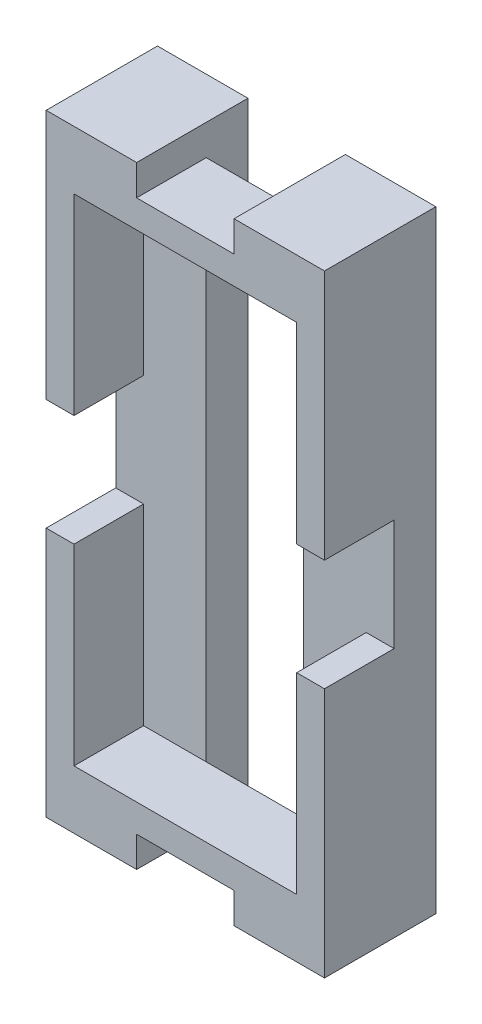
ISO-10303-21;
HEADER;
FILE_DESCRIPTION(('STEP AP214'),'2;1');
FILE_NAME('part.step','',(''),(''),'','','');
FILE_SCHEMA(('AUTOMOTIVE_DESIGN { 1 0 10303 214 1 1 1 1 }'));
ENDSEC;
DATA;
#1=APPLICATION_CONTEXT('core data for automotive mechanical design processes');
#2=APPLICATION_PROTOCOL_DEFINITION('international standard','automotive_design',2000,#1);
#3=PRODUCT_CONTEXT('',#1,'mechanical');
#4=PRODUCT('Part','Part','',(#3));
#5=PRODUCT_RELATED_PRODUCT_CATEGORY('part','',(#4));
#6=PRODUCT_DEFINITION_FORMATION('','',#4);
#7=PRODUCT_DEFINITION_CONTEXT('part definition',#1,'design');
#8=PRODUCT_DEFINITION('design','',#6,#7);
#9=PRODUCT_DEFINITION_SHAPE('','',#8);
#10=(LENGTH_UNIT() NAMED_UNIT(*) SI_UNIT(.MILLI.,.METRE.));
#11=(NAMED_UNIT(*) PLANE_ANGLE_UNIT() SI_UNIT($,.RADIAN.));
#12=(NAMED_UNIT(*) SI_UNIT($,.STERADIAN.) SOLID_ANGLE_UNIT());
#13=UNCERTAINTY_MEASURE_WITH_UNIT(LENGTH_MEASURE(1.E-05),#10,'distance_accuracy_value','');
#14=(GEOMETRIC_REPRESENTATION_CONTEXT(3) GLOBAL_UNCERTAINTY_ASSIGNED_CONTEXT((#13)) GLOBAL_UNIT_ASSIGNED_CONTEXT((#10,
#11,#12)) REPRESENTATION_CONTEXT('',''));
#15=CARTESIAN_POINT('',(0.,0.,0.));
#16=DIRECTION('',(0.,0.,1.));
#17=DIRECTION('',(1.,0.,0.));
#18=AXIS2_PLACEMENT_3D('',#15,#16,#17);
#19=CARTESIAN_POINT('',(0.,0.,4.));
#20=DIRECTION('',(0.,0.,-1.));
#21=DIRECTION('',(-1.,0.,0.));
#22=AXIS2_PLACEMENT_3D('',#19,#20,#21);
#23=PLANE('',#22);
#24=DIRECTION('',(0.,-1.,0.));
#25=VECTOR('',#24,1.);
#26=CARTESIAN_POINT('',(-5.,-11.,4.));
#27=LINE('',#26,#25);
#28=CARTESIAN_POINT('',(-5.,11.,4.));
#29=VERTEX_POINT('',#28);
#30=CARTESIAN_POINT('',(-5.,2.,4.));
#31=VERTEX_POINT('',#30);
#32=EDGE_CURVE('E350',#29,#31,#27,.T.);
#33=ORIENTED_EDGE('',*,*,#32,.T.);
#34=DIRECTION('',(-1.,0.,0.));
#35=VECTOR('',#34,1.);
#36=CARTESIAN_POINT('',(9.7169905660283,2.,4.));
#37=LINE('',#36,#35);
#38=CARTESIAN_POINT('',(-4.,2.,4.));
#39=VERTEX_POINT('',#38);
#40=EDGE_CURVE('E236',#39,#31,#37,.T.);
#41=ORIENTED_EDGE('',*,*,#40,.F.);
#42=DIRECTION('',(0.,-1.,0.));
#43=VECTOR('',#42,1.);
#44=CARTESIAN_POINT('',(-4.,-8.9,4.));
#45=LINE('',#44,#43);
#46=CARTESIAN_POINT('',(-4.,8.9,4.));
#47=VERTEX_POINT('',#46);
#48=EDGE_CURVE('E268',#47,#39,#45,.T.);
#49=ORIENTED_EDGE('',*,*,#48,.F.);
#50=DIRECTION('',(-1.,0.,0.));
#51=VECTOR('',#50,1.);
#52=CARTESIAN_POINT('',(-4.,8.9,4.));
#53=LINE('',#52,#51);
#54=CARTESIAN_POINT('',(4.,8.9,4.));
#55=VERTEX_POINT('',#54);
#56=EDGE_CURVE('E264',#55,#47,#53,.T.);
#57=ORIENTED_EDGE('',*,*,#56,.F.);
#58=DIRECTION('',(0.,1.,0.));
#59=VECTOR('',#58,1.);
#60=CARTESIAN_POINT('',(4.,-8.9,4.));
#61=LINE('',#60,#59);
#62=CARTESIAN_POINT('',(4.,2.,4.));
#63=VERTEX_POINT('',#62);
#64=EDGE_CURVE('E248',#63,#55,#61,.T.);
#65=ORIENTED_EDGE('',*,*,#64,.F.);
#66=CARTESIAN_POINT('',(5.,2.,4.));
#67=VERTEX_POINT('',#66);
#68=EDGE_CURVE('E234',#67,#63,#37,.T.);
#69=ORIENTED_EDGE('',*,*,#68,.F.);
#70=DIRECTION('',(0.,1.,0.));
#71=VECTOR('',#70,1.);
#72=CARTESIAN_POINT('',(5.,-11.,4.));
#73=LINE('',#72,#71);
#74=CARTESIAN_POINT('',(5.,11.,4.));
#75=VERTEX_POINT('',#74);
#76=EDGE_CURVE('E346',#67,#75,#73,.T.);
#77=ORIENTED_EDGE('',*,*,#76,.T.);
#78=DIRECTION('',(-1.,0.,0.));
#79=VECTOR('',#78,1.);
#80=CARTESIAN_POINT('',(-5.,11.,4.));
#81=LINE('',#80,#79);
#82=CARTESIAN_POINT('',(1.75,11.,4.));
#83=VERTEX_POINT('',#82);
#84=EDGE_CURVE('E347',#75,#83,#81,.T.);
#85=ORIENTED_EDGE('',*,*,#84,.T.);
#86=DIRECTION('',(0.,1.,0.));
#87=VECTOR('',#86,1.);
#88=CARTESIAN_POINT('',(1.75,11.,4.));
#89=LINE('',#88,#87);
#90=CARTESIAN_POINT('',(1.75,9.9,4.));
#91=VERTEX_POINT('',#90);
#92=EDGE_CURVE('E305',#91,#83,#89,.T.);
#93=ORIENTED_EDGE('',*,*,#92,.F.);
#94=DIRECTION('',(1.,0.,0.));
#95=VECTOR('',#94,1.);
#96=CARTESIAN_POINT('',(1.75,9.9,4.));
#97=LINE('',#96,#95);
#98=CARTESIAN_POINT('',(-1.75,9.9,4.));
#99=VERTEX_POINT('',#98);
#100=EDGE_CURVE('E309',#99,#91,#97,.T.);
#101=ORIENTED_EDGE('',*,*,#100,.F.);
#102=DIRECTION('',(0.,-1.,0.));
#103=VECTOR('',#102,1.);
#104=CARTESIAN_POINT('',(-1.75,11.,4.));
#105=LINE('',#104,#103);
#106=CARTESIAN_POINT('',(-1.75,11.,4.));
#107=VERTEX_POINT('',#106);
#108=EDGE_CURVE('E303',#107,#99,#105,.T.);
#109=ORIENTED_EDGE('',*,*,#108,.F.);
#110=EDGE_CURVE('E345',#107,#29,#81,.T.);
#111=ORIENTED_EDGE('',*,*,#110,.T.);
#112=EDGE_LOOP('',(#33,#41,#49,#57,#65,#69,#77,#85,#93,#101,#109,#111));
#113=FACE_BOUND('',#112,.T.);
#114=ADVANCED_FACE('F32',(#113),#23,.F.);
#115=CARTESIAN_POINT('',(4.,-8.9,-18.0151223414049));
#116=DIRECTION('',(1.,0.,0.));
#117=DIRECTION('',(0.,0.,-1.));
#118=AXIS2_PLACEMENT_3D('',#115,#116,#117);
#119=PLANE('',#118);
#120=DIRECTION('',(0.,-1.,0.));
#121=VECTOR('',#120,1.);
#122=CARTESIAN_POINT('',(4.,-8.9,1.5));
#123=LINE('',#122,#121);
#124=CARTESIAN_POINT('',(4.,8.9,1.5));
#125=VERTEX_POINT('',#124);
#126=CARTESIAN_POINT('',(4.,2.,1.5));
#127=VERTEX_POINT('',#126);
#128=EDGE_CURVE('E257',#125,#127,#123,.T.);
#129=ORIENTED_EDGE('',*,*,#128,.T.);
#130=DIRECTION('',(0.,0.,1.));
#131=VECTOR('',#130,1.);
#132=CARTESIAN_POINT('',(4.,2.,-18.0151223414049));
#133=LINE('',#132,#131);
#134=EDGE_CURVE('E245',#127,#63,#133,.T.);
#135=ORIENTED_EDGE('',*,*,#134,.T.);
#136=ORIENTED_EDGE('',*,*,#64,.T.);
#137=DIRECTION('',(0.,0.,1.));
#138=VECTOR('',#137,1.);
#139=CARTESIAN_POINT('',(4.,8.9,-18.0151223414049));
#140=LINE('',#139,#138);
#141=EDGE_CURVE('E274',#125,#55,#140,.T.);
#142=ORIENTED_EDGE('',*,*,#141,.F.);
#143=EDGE_LOOP('',(#129,#135,#136,#142));
#144=FACE_BOUND('',#143,.T.);
#145=ADVANCED_FACE('F480',(#144),#119,.F.);
#146=CARTESIAN_POINT('',(-4.,-8.9,-18.0151223414049));
#147=DIRECTION('',(-1.,0.,0.));
#148=DIRECTION('',(0.,0.,1.));
#149=AXIS2_PLACEMENT_3D('',#146,#147,#148);
#150=PLANE('',#149);
#151=ORIENTED_EDGE('',*,*,#48,.T.);
#152=DIRECTION('',(0.,0.,-1.));
#153=VECTOR('',#152,1.);
#154=CARTESIAN_POINT('',(-4.,2.,-18.0151223414049));
#155=LINE('',#154,#153);
#156=CARTESIAN_POINT('',(-4.,2.,1.5));
#157=VERTEX_POINT('',#156);
#158=EDGE_CURVE('E11',#39,#157,#155,.T.);
#159=ORIENTED_EDGE('',*,*,#158,.T.);
#160=DIRECTION('',(0.,1.,0.));
#161=VECTOR('',#160,1.);
#162=CARTESIAN_POINT('',(-4.,-8.9,1.5));
#163=LINE('',#162,#161);
#164=CARTESIAN_POINT('',(-4.,8.9,1.5));
#165=VERTEX_POINT('',#164);
#166=EDGE_CURVE('E252',#157,#165,#163,.T.);
#167=ORIENTED_EDGE('',*,*,#166,.T.);
#168=DIRECTION('',(0.,0.,1.));
#169=VECTOR('',#168,1.);
#170=CARTESIAN_POINT('',(-4.,8.9,-18.0151223414049));
#171=LINE('',#170,#169);
#172=EDGE_CURVE('E280',#165,#47,#171,.T.);
#173=ORIENTED_EDGE('',*,*,#172,.T.);
#174=EDGE_LOOP('',(#151,#159,#167,#173));
#175=FACE_BOUND('',#174,.T.);
#176=ADVANCED_FACE('F488',(#175),#150,.F.);
#177=CARTESIAN_POINT('',(0.,0.,1.5));
#178=DIRECTION('',(0.,0.,1.));
#179=DIRECTION('',(1.,0.,0.));
#180=AXIS2_PLACEMENT_3D('',#177,#178,#179);
#181=PLANE('',#180);
#182=DIRECTION('',(0.,1.,0.));
#183=VECTOR('',#182,1.);
#184=CARTESIAN_POINT('',(-1.75,-11.,1.5));
#185=LINE('',#184,#183);
#186=CARTESIAN_POINT('',(-1.75,-9.9,1.5));
#187=VERTEX_POINT('',#186);
#188=CARTESIAN_POINT('',(-1.75,-8.9,1.5));
#189=VERTEX_POINT('',#188);
#190=EDGE_CURVE('E318',#187,#189,#185,.T.);
#191=ORIENTED_EDGE('',*,*,#190,.T.);
#192=DIRECTION('',(1.,0.,0.));
#193=VECTOR('',#192,1.);
#194=CARTESIAN_POINT('',(0.,-8.9,1.5));
#195=LINE('',#194,#193);
#196=CARTESIAN_POINT('',(1.75,-8.9,1.5));
#197=VERTEX_POINT('',#196);
#198=EDGE_CURVE('E384',#189,#197,#195,.T.);
#199=ORIENTED_EDGE('',*,*,#198,.T.);
#200=DIRECTION('',(0.,-1.,0.));
#201=VECTOR('',#200,1.);
#202=CARTESIAN_POINT('',(1.75,-11.,1.5));
#203=LINE('',#202,#201);
#204=CARTESIAN_POINT('',(1.75,-9.9,1.5));
#205=VERTEX_POINT('',#204);
#206=EDGE_CURVE('E321',#197,#205,#203,.T.);
#207=ORIENTED_EDGE('',*,*,#206,.T.);
#208=DIRECTION('',(1.,0.,0.));
#209=VECTOR('',#208,1.);
#210=CARTESIAN_POINT('',(1.75,-9.9,1.5));
#211=LINE('',#210,#209);
#212=EDGE_CURVE('E287',#187,#205,#211,.T.);
#213=ORIENTED_EDGE('',*,*,#212,.F.);
#214=EDGE_LOOP('',(#191,#199,#207,#213));
#215=FACE_BOUND('',#214,.T.);
#216=ADVANCED_FACE('F427',(#215),#181,.F.);
#217=CARTESIAN_POINT('',(-5.,-11.,4.));
#218=DIRECTION('',(0.,1.,0.));
#219=DIRECTION('',(0.,0.,1.));
#220=AXIS2_PLACEMENT_3D('',#217,#218,#219);
#221=PLANE('',#220);
#222=DIRECTION('',(1.,0.,0.));
#223=VECTOR('',#222,1.);
#224=CARTESIAN_POINT('',(-5.,-11.,4.));
#225=LINE('',#224,#223);
#226=CARTESIAN_POINT('',(1.75,-11.,4.));
#227=VERTEX_POINT('',#226);
#228=CARTESIAN_POINT('',(5.,-11.,4.));
#229=VERTEX_POINT('',#228);
#230=EDGE_CURVE('E353',#227,#229,#225,.T.);
#231=ORIENTED_EDGE('',*,*,#230,.F.);
#232=DIRECTION('',(0.,0.,-1.));
#233=VECTOR('',#232,1.);
#234=CARTESIAN_POINT('',(1.75,-11.,1.5));
#235=LINE('',#234,#233);
#236=CARTESIAN_POINT('',(1.75,-11.,0.));
#237=VERTEX_POINT('',#236);
#238=EDGE_CURVE('E335',#227,#237,#235,.T.);
#239=ORIENTED_EDGE('',*,*,#238,.T.);
#240=DIRECTION('',(1.,0.,0.));
#241=VECTOR('',#240,1.);
#242=CARTESIAN_POINT('',(-5.,-11.,0.));
#243=LINE('',#242,#241);
#244=CARTESIAN_POINT('',(5.,-11.,0.));
#245=VERTEX_POINT('',#244);
#246=EDGE_CURVE('E366',#237,#245,#243,.T.);
#247=ORIENTED_EDGE('',*,*,#246,.T.);
#248=DIRECTION('',(0.,0.,-1.));
#249=VECTOR('',#248,1.);
#250=CARTESIAN_POINT('',(5.,-11.,4.));
#251=LINE('',#250,#249);
#252=EDGE_CURVE('E357',#229,#245,#251,.T.);
#253=ORIENTED_EDGE('',*,*,#252,.F.);
#254=EDGE_LOOP('',(#231,#239,#247,#253));
#255=FACE_BOUND('',#254,.T.);
#256=ADVANCED_FACE('F468',(#255),#221,.F.);
#257=CARTESIAN_POINT('',(-5.,11.,4.));
#258=DIRECTION('',(0.,-1.,0.));
#259=DIRECTION('',(0.,0.,-1.));
#260=AXIS2_PLACEMENT_3D('',#257,#258,#259);
#261=PLANE('',#260);
#262=DIRECTION('',(0.,0.,-1.));
#263=VECTOR('',#262,1.);
#264=CARTESIAN_POINT('',(1.75,11.,1.5));
#265=LINE('',#264,#263);
#266=CARTESIAN_POINT('',(1.75,11.,0.));
#267=VERTEX_POINT('',#266);
#268=EDGE_CURVE('E338',#83,#267,#265,.T.);
#269=ORIENTED_EDGE('',*,*,#268,.F.);
#270=ORIENTED_EDGE('',*,*,#84,.F.);
#271=DIRECTION('',(0.,0.,-1.));
#272=VECTOR('',#271,1.);
#273=CARTESIAN_POINT('',(5.,11.,4.));
#274=LINE('',#273,#272);
#275=CARTESIAN_POINT('',(5.,11.,0.));
#276=VERTEX_POINT('',#275);
#277=EDGE_CURVE('E378',#75,#276,#274,.T.);
#278=ORIENTED_EDGE('',*,*,#277,.T.);
#279=DIRECTION('',(-1.,0.,0.));
#280=VECTOR('',#279,1.);
#281=CARTESIAN_POINT('',(-5.,11.,0.));
#282=LINE('',#281,#280);
#283=EDGE_CURVE('E361',#276,#267,#282,.T.);
#284=ORIENTED_EDGE('',*,*,#283,.T.);
#285=EDGE_LOOP('',(#269,#270,#278,#284));
#286=FACE_BOUND('',#285,.T.);
#287=ADVANCED_FACE('F459',(#286),#261,.F.);
#288=CARTESIAN_POINT('',(0.,0.,0.));
#289=DIRECTION('',(0.,0.,-1.));
#290=DIRECTION('',(-1.,0.,0.));
#291=AXIS2_PLACEMENT_3D('',#288,#289,#290);
#292=PLANE('',#291);
#293=DIRECTION('',(0.,1.,0.));
#294=VECTOR('',#293,1.);
#295=CARTESIAN_POINT('',(-1.75,-11.,0.));
#296=LINE('',#295,#294);
#297=CARTESIAN_POINT('',(-1.75,-11.,0.));
#298=VERTEX_POINT('',#297);
#299=CARTESIAN_POINT('',(-1.75,11.,0.));
#300=VERTEX_POINT('',#299);
#301=EDGE_CURVE('E317',#298,#300,#296,.T.);
#302=ORIENTED_EDGE('',*,*,#301,.F.);
#303=CARTESIAN_POINT('',(-5.,-11.,0.));
#304=VERTEX_POINT('',#303);
#305=EDGE_CURVE('E367',#304,#298,#243,.T.);
#306=ORIENTED_EDGE('',*,*,#305,.F.);
#307=DIRECTION('',(0.,-1.,0.));
#308=VECTOR('',#307,1.);
#309=CARTESIAN_POINT('',(-5.,-11.,0.));
#310=LINE('',#309,#308);
#311=CARTESIAN_POINT('',(-5.,11.,0.));
#312=VERTEX_POINT('',#311);
#313=EDGE_CURVE('E364',#312,#304,#310,.T.);
#314=ORIENTED_EDGE('',*,*,#313,.F.);
#315=EDGE_CURVE('E360',#300,#312,#282,.T.);
#316=ORIENTED_EDGE('',*,*,#315,.F.);
#317=EDGE_LOOP('',(#302,#306,#314,#316));
#318=FACE_BOUND('',#317,.T.);
#319=ADVANCED_FACE('F442',(#318),#292,.T.);
#320=CARTESIAN_POINT('',(5.,-11.,4.));
#321=DIRECTION('',(-1.,0.,0.));
#322=DIRECTION('',(0.,0.,1.));
#323=AXIS2_PLACEMENT_3D('',#320,#321,#322);
#324=PLANE('',#323);
#325=ORIENTED_EDGE('',*,*,#76,.F.);
#326=DIRECTION('',(0.,0.,1.));
#327=VECTOR('',#326,1.);
#328=CARTESIAN_POINT('',(5.,2.,1.5));
#329=LINE('',#328,#327);
#330=CARTESIAN_POINT('',(5.,2.,1.5));
#331=VERTEX_POINT('',#330);
#332=EDGE_CURVE('E233',#331,#67,#329,.T.);
#333=ORIENTED_EDGE('',*,*,#332,.F.);
#334=DIRECTION('',(0.,1.,0.));
#335=VECTOR('',#334,1.);
#336=CARTESIAN_POINT('',(5.,2.,1.5));
#337=LINE('',#336,#335);
#338=CARTESIAN_POINT('',(5.,-2.,1.5));
#339=VERTEX_POINT('',#338);
#340=EDGE_CURVE('E243',#339,#331,#337,.T.);
#341=ORIENTED_EDGE('',*,*,#340,.F.);
#342=DIRECTION('',(0.,0.,-1.));
#343=VECTOR('',#342,1.);
#344=CARTESIAN_POINT('',(5.,-2.,1.5));
#345=LINE('',#344,#343);
#346=CARTESIAN_POINT('',(5.,-2.,4.));
#347=VERTEX_POINT('',#346);
#348=EDGE_CURVE('E240',#347,#339,#345,.T.);
#349=ORIENTED_EDGE('',*,*,#348,.F.);
#350=EDGE_CURVE('E342',#229,#347,#73,.T.);
#351=ORIENTED_EDGE('',*,*,#350,.F.);
#352=ORIENTED_EDGE('',*,*,#252,.T.);
#353=DIRECTION('',(0.,1.,0.));
#354=VECTOR('',#353,1.);
#355=CARTESIAN_POINT('',(5.,-11.,0.));
#356=LINE('',#355,#354);
#357=EDGE_CURVE('E334',#245,#276,#356,.T.);
#358=ORIENTED_EDGE('',*,*,#357,.T.);
#359=ORIENTED_EDGE('',*,*,#277,.F.);
#360=EDGE_LOOP('',(#325,#333,#341,#349,#351,#352,#358,#359));
#361=FACE_BOUND('',#360,.T.);
#362=ADVANCED_FACE('F34',(#361),#324,.F.);
#363=ORIENTED_EDGE('',*,*,#110,.F.);
#364=DIRECTION('',(0.,0.,-1.));
#365=VECTOR('',#364,1.);
#366=CARTESIAN_POINT('',(-1.75,11.,1.5));
#367=LINE('',#366,#365);
#368=EDGE_CURVE('E327',#107,#300,#367,.T.);
#369=ORIENTED_EDGE('',*,*,#368,.T.);
#370=ORIENTED_EDGE('',*,*,#315,.T.);
#371=DIRECTION('',(0.,0.,-1.));
#372=VECTOR('',#371,1.);
#373=CARTESIAN_POINT('',(-5.,11.,4.));
#374=LINE('',#373,#372);
#375=EDGE_CURVE('E375',#29,#312,#374,.T.);
#376=ORIENTED_EDGE('',*,*,#375,.F.);
#377=EDGE_LOOP('',(#363,#369,#370,#376));
#378=FACE_BOUND('',#377,.T.);
#379=ADVANCED_FACE('F447',(#378),#261,.F.);
#380=CARTESIAN_POINT('',(-5.,-11.,4.));
#381=DIRECTION('',(1.,0.,0.));
#382=DIRECTION('',(0.,0.,-1.));
#383=AXIS2_PLACEMENT_3D('',#380,#381,#382);
#384=PLANE('',#383);
#385=DIRECTION('',(0.,-1.,0.));
#386=VECTOR('',#385,1.);
#387=CARTESIAN_POINT('',(-5.,2.,1.5));
#388=LINE('',#387,#386);
#389=CARTESIAN_POINT('',(-5.,2.,1.5));
#390=VERTEX_POINT('',#389);
#391=CARTESIAN_POINT('',(-5.,-2.,1.5));
#392=VERTEX_POINT('',#391);
#393=EDGE_CURVE('E214',#390,#392,#388,.T.);
#394=ORIENTED_EDGE('',*,*,#393,.F.);
#395=DIRECTION('',(0.,0.,-1.));
#396=VECTOR('',#395,1.);
#397=CARTESIAN_POINT('',(-5.,2.,1.5));
#398=LINE('',#397,#396);
#399=EDGE_CURVE('E211',#31,#390,#398,.T.);
#400=ORIENTED_EDGE('',*,*,#399,.F.);
#401=ORIENTED_EDGE('',*,*,#32,.F.);
#402=ORIENTED_EDGE('',*,*,#375,.T.);
#403=ORIENTED_EDGE('',*,*,#313,.T.);
#404=DIRECTION('',(0.,0.,-1.));
#405=VECTOR('',#404,1.);
#406=CARTESIAN_POINT('',(-5.,-11.,4.));
#407=LINE('',#406,#405);
#408=CARTESIAN_POINT('',(-5.,-11.,4.));
#409=VERTEX_POINT('',#408);
#410=EDGE_CURVE('E372',#409,#304,#407,.T.);
#411=ORIENTED_EDGE('',*,*,#410,.F.);
#412=CARTESIAN_POINT('',(-5.,-2.,4.));
#413=VERTEX_POINT('',#412);
#414=EDGE_CURVE('E225',#413,#409,#27,.T.);
#415=ORIENTED_EDGE('',*,*,#414,.F.);
#416=DIRECTION('',(0.,0.,1.));
#417=VECTOR('',#416,1.);
#418=CARTESIAN_POINT('',(-5.,-2.,1.5));
#419=LINE('',#418,#417);
#420=EDGE_CURVE('E207',#392,#413,#419,.T.);
#421=ORIENTED_EDGE('',*,*,#420,.F.);
#422=EDGE_LOOP('',(#394,#400,#401,#402,#403,#411,#415,#421));
#423=FACE_BOUND('',#422,.T.);
#424=ADVANCED_FACE('F223',(#423),#384,.F.);
#425=DIRECTION('',(0.,0.,-1.));
#426=VECTOR('',#425,1.);
#427=CARTESIAN_POINT('',(-1.75,-11.,1.5));
#428=LINE('',#427,#426);
#429=CARTESIAN_POINT('',(-1.75,-11.,4.));
#430=VERTEX_POINT('',#429);
#431=EDGE_CURVE('E332',#430,#298,#428,.T.);
#432=ORIENTED_EDGE('',*,*,#431,.F.);
#433=EDGE_CURVE('E354',#409,#430,#225,.T.);
#434=ORIENTED_EDGE('',*,*,#433,.F.);
#435=ORIENTED_EDGE('',*,*,#410,.T.);
#436=ORIENTED_EDGE('',*,*,#305,.T.);
#437=EDGE_LOOP('',(#432,#434,#435,#436));
#438=FACE_BOUND('',#437,.T.);
#439=ADVANCED_FACE('F437',(#438),#221,.F.);
#440=ORIENTED_EDGE('',*,*,#350,.T.);
#441=DIRECTION('',(-1.,0.,0.));
#442=VECTOR('',#441,1.);
#443=CARTESIAN_POINT('',(9.7169905660283,-2.,4.));
#444=LINE('',#443,#442);
#445=CARTESIAN_POINT('',(4.,-2.,4.));
#446=VERTEX_POINT('',#445);
#447=EDGE_CURVE('E237',#347,#446,#444,.T.);
#448=ORIENTED_EDGE('',*,*,#447,.T.);
#449=CARTESIAN_POINT('',(4.,-8.9,4.));
#450=VERTEX_POINT('',#449);
#451=EDGE_CURVE('E261',#450,#446,#61,.T.);
#452=ORIENTED_EDGE('',*,*,#451,.F.);
#453=DIRECTION('',(1.,0.,0.));
#454=VECTOR('',#453,1.);
#455=CARTESIAN_POINT('',(-4.,-8.9,4.));
#456=LINE('',#455,#454);
#457=CARTESIAN_POINT('',(-4.,-8.9,4.));
#458=VERTEX_POINT('',#457);
#459=EDGE_CURVE('E271',#458,#450,#456,.T.);
#460=ORIENTED_EDGE('',*,*,#459,.F.);
#461=CARTESIAN_POINT('',(-4.,-2.,4.));
#462=VERTEX_POINT('',#461);
#463=EDGE_CURVE('E267',#462,#458,#45,.T.);
#464=ORIENTED_EDGE('',*,*,#463,.F.);
#465=EDGE_CURVE('E55',#462,#413,#444,.T.);
#466=ORIENTED_EDGE('',*,*,#465,.T.);
#467=ORIENTED_EDGE('',*,*,#414,.T.);
#468=ORIENTED_EDGE('',*,*,#433,.T.);
#469=DIRECTION('',(0.,-1.,0.));
#470=VECTOR('',#469,1.);
#471=CARTESIAN_POINT('',(-1.75,-11.,4.));
#472=LINE('',#471,#470);
#473=CARTESIAN_POINT('',(-1.75,-9.9,4.));
#474=VERTEX_POINT('',#473);
#475=EDGE_CURVE('E288',#474,#430,#472,.T.);
#476=ORIENTED_EDGE('',*,*,#475,.F.);
#477=DIRECTION('',(-1.,0.,0.));
#478=VECTOR('',#477,1.);
#479=CARTESIAN_POINT('',(1.75,-9.9,4.));
#480=LINE('',#479,#478);
#481=CARTESIAN_POINT('',(1.75,-9.9,4.));
#482=VERTEX_POINT('',#481);
#483=EDGE_CURVE('E291',#482,#474,#480,.T.);
#484=ORIENTED_EDGE('',*,*,#483,.F.);
#485=DIRECTION('',(0.,1.,0.));
#486=VECTOR('',#485,1.);
#487=CARTESIAN_POINT('',(1.75,-11.,4.));
#488=LINE('',#487,#486);
#489=EDGE_CURVE('E294',#227,#482,#488,.T.);
#490=ORIENTED_EDGE('',*,*,#489,.F.);
#491=ORIENTED_EDGE('',*,*,#230,.T.);
#492=EDGE_LOOP('',(#440,#448,#452,#460,#464,#466,#467,#468,#476,#484,#490,#491));
#493=FACE_BOUND('',#492,.T.);
#494=ADVANCED_FACE('F392',(#493),#23,.F.);
#495=DIRECTION('',(0.,-1.,0.));
#496=VECTOR('',#495,1.);
#497=CARTESIAN_POINT('',(1.75,-11.,0.));
#498=LINE('',#497,#496);
#499=EDGE_CURVE('E330',#267,#237,#498,.T.);
#500=ORIENTED_EDGE('',*,*,#499,.F.);
#501=ORIENTED_EDGE('',*,*,#283,.F.);
#502=ORIENTED_EDGE('',*,*,#357,.F.);
#503=ORIENTED_EDGE('',*,*,#246,.F.);
#504=EDGE_LOOP('',(#500,#501,#502,#503));
#505=FACE_BOUND('',#504,.T.);
#506=ADVANCED_FACE('F457',(#505),#292,.T.);
#507=CARTESIAN_POINT('',(-1.75,-11.,1.5));
#508=DIRECTION('',(-1.,0.,0.));
#509=DIRECTION('',(0.,0.,1.));
#510=AXIS2_PLACEMENT_3D('',#507,#508,#509);
#511=PLANE('',#510);
#512=ORIENTED_EDGE('',*,*,#301,.T.);
#513=ORIENTED_EDGE('',*,*,#368,.F.);
#514=ORIENTED_EDGE('',*,*,#108,.T.);
#515=DIRECTION('',(0.,0.,-1.));
#516=VECTOR('',#515,1.);
#517=CARTESIAN_POINT('',(-1.75,9.9,7.66878726556883));
#518=LINE('',#517,#516);
#519=CARTESIAN_POINT('',(-1.75,9.9,1.5));
#520=VERTEX_POINT('',#519);
#521=EDGE_CURVE('E306',#99,#520,#518,.T.);
#522=ORIENTED_EDGE('',*,*,#521,.T.);
#523=CARTESIAN_POINT('',(-1.75,8.9,1.5));
#524=VERTEX_POINT('',#523);
#525=EDGE_CURVE('E323',#524,#520,#185,.T.);
#526=ORIENTED_EDGE('',*,*,#525,.F.);
#527=EDGE_CURVE('E322',#189,#524,#185,.T.);
#528=ORIENTED_EDGE('',*,*,#527,.F.);
#529=ORIENTED_EDGE('',*,*,#190,.F.);
#530=DIRECTION('',(0.,0.,-1.));
#531=VECTOR('',#530,1.);
#532=CARTESIAN_POINT('',(-1.75,-9.9,7.66878726556883));
#533=LINE('',#532,#531);
#534=EDGE_CURVE('E299',#474,#187,#533,.T.);
#535=ORIENTED_EDGE('',*,*,#534,.F.);
#536=ORIENTED_EDGE('',*,*,#475,.T.);
#537=ORIENTED_EDGE('',*,*,#431,.T.);
#538=EDGE_LOOP('',(#512,#513,#514,#522,#526,#528,#529,#535,#536,#537));
#539=FACE_BOUND('',#538,.T.);
#540=ADVANCED_FACE('F412',(#539),#511,.F.);
#541=CARTESIAN_POINT('',(1.75,-11.,1.5));
#542=DIRECTION('',(1.,0.,0.));
#543=DIRECTION('',(0.,0.,-1.));
#544=AXIS2_PLACEMENT_3D('',#541,#542,#543);
#545=PLANE('',#544);
#546=ORIENTED_EDGE('',*,*,#499,.T.);
#547=ORIENTED_EDGE('',*,*,#238,.F.);
#548=ORIENTED_EDGE('',*,*,#489,.T.);
#549=DIRECTION('',(0.,0.,-1.));
#550=VECTOR('',#549,1.);
#551=CARTESIAN_POINT('',(1.75,-9.9,7.66878726556883));
#552=LINE('',#551,#550);
#553=EDGE_CURVE('E292',#482,#205,#552,.T.);
#554=ORIENTED_EDGE('',*,*,#553,.T.);
#555=ORIENTED_EDGE('',*,*,#206,.F.);
#556=CARTESIAN_POINT('',(1.75,8.9,1.5));
#557=VERTEX_POINT('',#556);
#558=EDGE_CURVE('E328',#557,#197,#203,.T.);
#559=ORIENTED_EDGE('',*,*,#558,.F.);
#560=CARTESIAN_POINT('',(1.75,9.9,1.5));
#561=VERTEX_POINT('',#560);
#562=EDGE_CURVE('E324',#561,#557,#203,.T.);
#563=ORIENTED_EDGE('',*,*,#562,.F.);
#564=DIRECTION('',(0.,0.,-1.));
#565=VECTOR('',#564,1.);
#566=CARTESIAN_POINT('',(1.75,9.9,7.66878726556883));
#567=LINE('',#566,#565);
#568=EDGE_CURVE('E312',#91,#561,#567,.T.);
#569=ORIENTED_EDGE('',*,*,#568,.F.);
#570=ORIENTED_EDGE('',*,*,#92,.T.);
#571=ORIENTED_EDGE('',*,*,#268,.T.);
#572=EDGE_LOOP('',(#546,#547,#548,#554,#555,#559,#563,#569,#570,#571));
#573=FACE_BOUND('',#572,.T.);
#574=ADVANCED_FACE('F420',(#573),#545,.F.);
#575=ORIENTED_EDGE('',*,*,#562,.T.);
#576=DIRECTION('',(-1.,0.,0.));
#577=VECTOR('',#576,1.);
#578=CARTESIAN_POINT('',(0.,8.9,1.5));
#579=LINE('',#578,#577);
#580=EDGE_CURVE('E381',#557,#524,#579,.T.);
#581=ORIENTED_EDGE('',*,*,#580,.T.);
#582=ORIENTED_EDGE('',*,*,#525,.T.);
#583=DIRECTION('',(-1.,0.,0.));
#584=VECTOR('',#583,1.);
#585=CARTESIAN_POINT('',(1.75,9.9,1.5));
#586=LINE('',#585,#584);
#587=EDGE_CURVE('E296',#561,#520,#586,.T.);
#588=ORIENTED_EDGE('',*,*,#587,.F.);
#589=EDGE_LOOP('',(#575,#581,#582,#588));
#590=FACE_BOUND('',#589,.T.);
#591=ADVANCED_FACE('F409',(#590),#181,.F.);
#592=CARTESIAN_POINT('',(1.75,9.9,7.66878726556883));
#593=DIRECTION('',(0.,-1.,0.));
#594=DIRECTION('',(0.,0.,-1.));
#595=AXIS2_PLACEMENT_3D('',#592,#593,#594);
#596=PLANE('',#595);
#597=ORIENTED_EDGE('',*,*,#100,.T.);
#598=ORIENTED_EDGE('',*,*,#568,.T.);
#599=ORIENTED_EDGE('',*,*,#587,.T.);
#600=ORIENTED_EDGE('',*,*,#521,.F.);
#601=EDGE_LOOP('',(#597,#598,#599,#600));
#602=FACE_BOUND('',#601,.T.);
#603=ADVANCED_FACE('F417',(#602),#596,.F.);
#604=CARTESIAN_POINT('',(1.75,-9.9,7.66878726556883));
#605=DIRECTION('',(0.,1.,0.));
#606=DIRECTION('',(0.,0.,1.));
#607=AXIS2_PLACEMENT_3D('',#604,#605,#606);
#608=PLANE('',#607);
#609=ORIENTED_EDGE('',*,*,#483,.T.);
#610=ORIENTED_EDGE('',*,*,#534,.T.);
#611=ORIENTED_EDGE('',*,*,#212,.T.);
#612=ORIENTED_EDGE('',*,*,#553,.F.);
#613=EDGE_LOOP('',(#609,#610,#611,#612));
#614=FACE_BOUND('',#613,.T.);
#615=ADVANCED_FACE('F432',(#614),#608,.F.);
#616=CARTESIAN_POINT('',(0.,0.,1.5));
#617=DIRECTION('',(0.,0.,1.));
#618=DIRECTION('',(1.,0.,0.));
#619=AXIS2_PLACEMENT_3D('',#616,#617,#618);
#620=PLANE('',#619);
#621=ORIENTED_EDGE('',*,*,#527,.T.);
#622=DIRECTION('',(1.,0.,0.));
#623=VECTOR('',#622,1.);
#624=CARTESIAN_POINT('',(-4.,8.9,1.5));
#625=LINE('',#624,#623);
#626=EDGE_CURVE('E284',#165,#524,#625,.T.);
#627=ORIENTED_EDGE('',*,*,#626,.F.);
#628=ORIENTED_EDGE('',*,*,#166,.F.);
#629=DIRECTION('',(-1.,0.,0.));
#630=VECTOR('',#629,1.);
#631=CARTESIAN_POINT('',(9.7169905660283,2.,1.5));
#632=LINE('',#631,#630);
#633=EDGE_CURVE('E217',#157,#390,#632,.T.);
#634=ORIENTED_EDGE('',*,*,#633,.T.);
#635=ORIENTED_EDGE('',*,*,#393,.T.);
#636=DIRECTION('',(-1.,0.,0.));
#637=VECTOR('',#636,1.);
#638=CARTESIAN_POINT('',(9.7169905660283,-2.,1.5));
#639=LINE('',#638,#637);
#640=CARTESIAN_POINT('',(-4.,-2.,1.5));
#641=VERTEX_POINT('',#640);
#642=EDGE_CURVE('E203',#641,#392,#639,.T.);
#643=ORIENTED_EDGE('',*,*,#642,.F.);
#644=CARTESIAN_POINT('',(-4.,-8.9,1.5));
#645=VERTEX_POINT('',#644);
#646=EDGE_CURVE('E249',#645,#641,#163,.T.);
#647=ORIENTED_EDGE('',*,*,#646,.F.);
#648=DIRECTION('',(-1.,0.,0.));
#649=VECTOR('',#648,1.);
#650=CARTESIAN_POINT('',(-4.,-8.9,1.5));
#651=LINE('',#650,#649);
#652=EDGE_CURVE('E251',#189,#645,#651,.T.);
#653=ORIENTED_EDGE('',*,*,#652,.F.);
#654=EDGE_LOOP('',(#621,#627,#628,#634,#635,#643,#647,#653));
#655=FACE_BOUND('',#654,.T.);
#656=ADVANCED_FACE('F215',(#655),#620,.T.);
#657=CARTESIAN_POINT('',(4.,-2.,1.5));
#658=VERTEX_POINT('',#657);
#659=CARTESIAN_POINT('',(4.,-8.9,1.5));
#660=VERTEX_POINT('',#659);
#661=EDGE_CURVE('E256',#658,#660,#123,.T.);
#662=ORIENTED_EDGE('',*,*,#661,.F.);
#663=EDGE_CURVE('E47',#339,#658,#639,.T.);
#664=ORIENTED_EDGE('',*,*,#663,.F.);
#665=ORIENTED_EDGE('',*,*,#340,.T.);
#666=EDGE_CURVE('E230',#331,#127,#632,.T.);
#667=ORIENTED_EDGE('',*,*,#666,.T.);
#668=ORIENTED_EDGE('',*,*,#128,.F.);
#669=EDGE_CURVE('E260',#557,#125,#625,.T.);
#670=ORIENTED_EDGE('',*,*,#669,.F.);
#671=ORIENTED_EDGE('',*,*,#558,.T.);
#672=EDGE_CURVE('E253',#660,#197,#651,.T.);
#673=ORIENTED_EDGE('',*,*,#672,.F.);
#674=EDGE_LOOP('',(#662,#664,#665,#667,#668,#670,#671,#673));
#675=FACE_BOUND('',#674,.T.);
#676=ADVANCED_FACE('F472',(#675),#620,.T.);
#677=ORIENTED_EDGE('',*,*,#451,.T.);
#678=DIRECTION('',(0.,0.,-1.));
#679=VECTOR('',#678,1.);
#680=CARTESIAN_POINT('',(4.,-2.,-18.0151223414049));
#681=LINE('',#680,#679);
#682=EDGE_CURVE('E242',#446,#658,#681,.T.);
#683=ORIENTED_EDGE('',*,*,#682,.T.);
#684=ORIENTED_EDGE('',*,*,#661,.T.);
#685=DIRECTION('',(0.,0.,1.));
#686=VECTOR('',#685,1.);
#687=CARTESIAN_POINT('',(4.,-8.9,-18.0151223414049));
#688=LINE('',#687,#686);
#689=EDGE_CURVE('E275',#660,#450,#688,.T.);
#690=ORIENTED_EDGE('',*,*,#689,.T.);
#691=EDGE_LOOP('',(#677,#683,#684,#690));
#692=FACE_BOUND('',#691,.T.);
#693=ADVANCED_FACE('F470',(#692),#119,.F.);
#694=CARTESIAN_POINT('',(-4.,-8.9,-18.0151223414049));
#695=DIRECTION('',(0.,-1.,0.));
#696=DIRECTION('',(0.,0.,-1.));
#697=AXIS2_PLACEMENT_3D('',#694,#695,#696);
#698=PLANE('',#697);
#699=ORIENTED_EDGE('',*,*,#672,.T.);
#700=ORIENTED_EDGE('',*,*,#198,.F.);
#701=ORIENTED_EDGE('',*,*,#652,.T.);
#702=DIRECTION('',(0.,0.,1.));
#703=VECTOR('',#702,1.);
#704=CARTESIAN_POINT('',(-4.,-8.9,-18.0151223414049));
#705=LINE('',#704,#703);
#706=EDGE_CURVE('E277',#645,#458,#705,.T.);
#707=ORIENTED_EDGE('',*,*,#706,.T.);
#708=ORIENTED_EDGE('',*,*,#459,.T.);
#709=ORIENTED_EDGE('',*,*,#689,.F.);
#710=EDGE_LOOP('',(#699,#700,#701,#707,#708,#709));
#711=FACE_BOUND('',#710,.T.);
#712=ADVANCED_FACE('F396',(#711),#698,.F.);
#713=ORIENTED_EDGE('',*,*,#646,.T.);
#714=DIRECTION('',(0.,0.,1.));
#715=VECTOR('',#714,1.);
#716=CARTESIAN_POINT('',(-4.,-2.,-18.0151223414049));
#717=LINE('',#716,#715);
#718=EDGE_CURVE('E40',#641,#462,#717,.T.);
#719=ORIENTED_EDGE('',*,*,#718,.T.);
#720=ORIENTED_EDGE('',*,*,#463,.T.);
#721=ORIENTED_EDGE('',*,*,#706,.F.);
#722=EDGE_LOOP('',(#713,#719,#720,#721));
#723=FACE_BOUND('',#722,.T.);
#724=ADVANCED_FACE('F388',(#723),#150,.F.);
#725=CARTESIAN_POINT('',(-4.,8.9,-18.0151223414049));
#726=DIRECTION('',(0.,1.,0.));
#727=DIRECTION('',(0.,0.,1.));
#728=AXIS2_PLACEMENT_3D('',#725,#726,#727);
#729=PLANE('',#728);
#730=ORIENTED_EDGE('',*,*,#626,.T.);
#731=ORIENTED_EDGE('',*,*,#580,.F.);
#732=ORIENTED_EDGE('',*,*,#669,.T.);
#733=ORIENTED_EDGE('',*,*,#141,.T.);
#734=ORIENTED_EDGE('',*,*,#56,.T.);
#735=ORIENTED_EDGE('',*,*,#172,.F.);
#736=EDGE_LOOP('',(#730,#731,#732,#733,#734,#735));
#737=FACE_BOUND('',#736,.T.);
#738=ADVANCED_FACE('F406',(#737),#729,.F.);
#739=CARTESIAN_POINT('',(9.7169905660283,-2.,1.5));
#740=DIRECTION('',(0.,-1.,0.));
#741=DIRECTION('',(0.,0.,-1.));
#742=AXIS2_PLACEMENT_3D('',#739,#740,#741);
#743=PLANE('',#742);
#744=ORIENTED_EDGE('',*,*,#642,.T.);
#745=ORIENTED_EDGE('',*,*,#420,.T.);
#746=ORIENTED_EDGE('',*,*,#465,.F.);
#747=ORIENTED_EDGE('',*,*,#718,.F.);
#748=EDGE_LOOP('',(#744,#745,#746,#747));
#749=FACE_BOUND('',#748,.T.);
#750=ADVANCED_FACE('F205',(#749),#743,.F.);
#751=CARTESIAN_POINT('',(9.7169905660283,2.,1.5));
#752=DIRECTION('',(0.,1.,0.));
#753=DIRECTION('',(0.,0.,1.));
#754=AXIS2_PLACEMENT_3D('',#751,#752,#753);
#755=PLANE('',#754);
#756=ORIENTED_EDGE('',*,*,#40,.T.);
#757=ORIENTED_EDGE('',*,*,#399,.T.);
#758=ORIENTED_EDGE('',*,*,#633,.F.);
#759=ORIENTED_EDGE('',*,*,#158,.F.);
#760=EDGE_LOOP('',(#756,#757,#758,#759));
#761=FACE_BOUND('',#760,.T.);
#762=ADVANCED_FACE('F657',(#761),#755,.F.);
#763=ORIENTED_EDGE('',*,*,#666,.F.);
#764=ORIENTED_EDGE('',*,*,#332,.T.);
#765=ORIENTED_EDGE('',*,*,#68,.T.);
#766=ORIENTED_EDGE('',*,*,#134,.F.);
#767=EDGE_LOOP('',(#763,#764,#765,#766));
#768=FACE_BOUND('',#767,.T.);
#769=ADVANCED_FACE('F666',(#768),#755,.F.);
#770=ORIENTED_EDGE('',*,*,#447,.F.);
#771=ORIENTED_EDGE('',*,*,#348,.T.);
#772=ORIENTED_EDGE('',*,*,#663,.T.);
#773=ORIENTED_EDGE('',*,*,#682,.F.);
#774=EDGE_LOOP('',(#770,#771,#772,#773));
#775=FACE_BOUND('',#774,.T.);
#776=ADVANCED_FACE('F658',(#775),#743,.F.);
#777=CLOSED_SHELL('',(#114,#145,#176,#216,#256,#287,#319,#362,#379,#424,#439,#494,#506,#540,
#574,#591,#603,#615,#656,#676,#693,#712,#724,#738,#750,#762,#769,#776));
#778=MANIFOLD_SOLID_BREP('B2',#777);
#779=ADVANCED_BREP_SHAPE_REPRESENTATION('',(#18,#778),#14);
#780=SHAPE_DEFINITION_REPRESENTATION(#9,#779);
ENDSEC;
END-ISO-10303-21;
